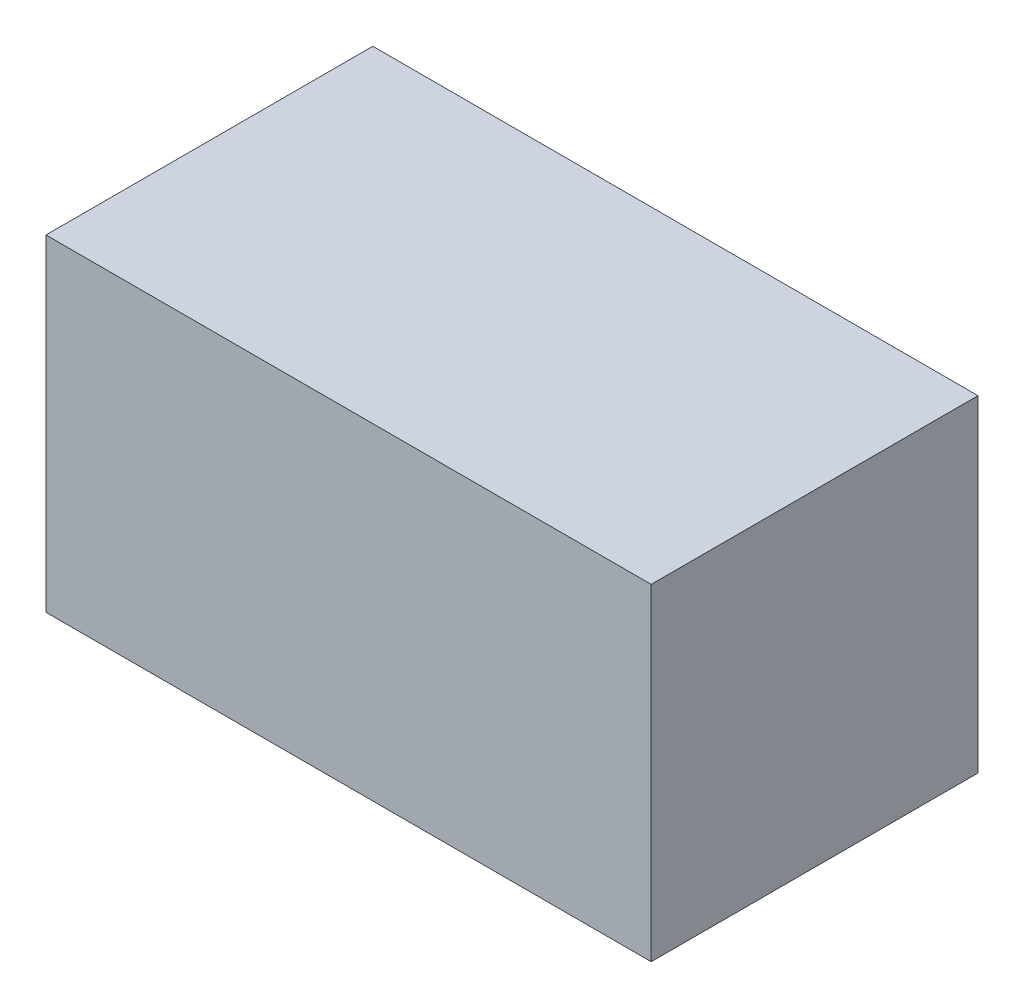
ISO-10303-21;
HEADER;
FILE_DESCRIPTION(('STEP AP214'),'2;1');
FILE_NAME('part.step','',(''),(''),'','','');
FILE_SCHEMA(('AUTOMOTIVE_DESIGN { 1 0 10303 214 1 1 1 1 }'));
ENDSEC;
DATA;
#1=APPLICATION_CONTEXT('core data for automotive mechanical design processes');
#2=APPLICATION_PROTOCOL_DEFINITION('international standard','automotive_design',2000,#1);
#3=PRODUCT_CONTEXT('',#1,'mechanical');
#4=PRODUCT('Part','Part','',(#3));
#5=PRODUCT_RELATED_PRODUCT_CATEGORY('part','',(#4));
#6=PRODUCT_DEFINITION_FORMATION('','',#4);
#7=PRODUCT_DEFINITION_CONTEXT('part definition',#1,'design');
#8=PRODUCT_DEFINITION('design','',#6,#7);
#9=PRODUCT_DEFINITION_SHAPE('','',#8);
#10=(LENGTH_UNIT() NAMED_UNIT(*) SI_UNIT(.MILLI.,.METRE.));
#11=(NAMED_UNIT(*) PLANE_ANGLE_UNIT() SI_UNIT($,.RADIAN.));
#12=(NAMED_UNIT(*) SI_UNIT($,.STERADIAN.) SOLID_ANGLE_UNIT());
#13=UNCERTAINTY_MEASURE_WITH_UNIT(LENGTH_MEASURE(1.E-05),#10,'distance_accuracy_value','');
#14=(GEOMETRIC_REPRESENTATION_CONTEXT(3) GLOBAL_UNCERTAINTY_ASSIGNED_CONTEXT((#13)) GLOBAL_UNIT_ASSIGNED_CONTEXT((#10,
#11,#12)) REPRESENTATION_CONTEXT('',''));
#15=CARTESIAN_POINT('',(0.,0.,0.));
#16=DIRECTION('',(0.,0.,1.));
#17=DIRECTION('',(1.,0.,0.));
#18=AXIS2_PLACEMENT_3D('',#15,#16,#17);
#19=CARTESIAN_POINT('',(1.25,-0.675,1.35));
#20=DIRECTION('',(0.,1.,0.));
#21=DIRECTION('',(0.,0.,1.));
#22=AXIS2_PLACEMENT_3D('',#19,#20,#21);
#23=PLANE('',#22);
#24=DIRECTION('',(1.,0.,0.));
#25=VECTOR('',#24,1.);
#26=CARTESIAN_POINT('',(1.25,-0.675,0.));
#27=LINE('',#26,#25);
#28=CARTESIAN_POINT('',(-1.25,-0.675,0.));
#29=VERTEX_POINT('',#28);
#30=CARTESIAN_POINT('',(1.25,-0.675,0.));
#31=VERTEX_POINT('',#30);
#32=EDGE_CURVE('E97',#29,#31,#27,.T.);
#33=ORIENTED_EDGE('',*,*,#32,.T.);
#34=DIRECTION('',(0.,0.,-1.));
#35=VECTOR('',#34,1.);
#36=CARTESIAN_POINT('',(1.25,-0.675,1.35));
#37=LINE('',#36,#35);
#38=CARTESIAN_POINT('',(1.25,-0.675,1.35));
#39=VERTEX_POINT('',#38);
#40=EDGE_CURVE('E11',#39,#31,#37,.T.);
#41=ORIENTED_EDGE('',*,*,#40,.F.);
#42=DIRECTION('',(1.,0.,0.));
#43=VECTOR('',#42,1.);
#44=CARTESIAN_POINT('',(1.25,-0.675,1.35));
#45=LINE('',#44,#43);
#46=CARTESIAN_POINT('',(-1.25,-0.675,1.35));
#47=VERTEX_POINT('',#46);
#48=EDGE_CURVE('E85',#47,#39,#45,.T.);
#49=ORIENTED_EDGE('',*,*,#48,.F.);
#50=DIRECTION('',(0.,0.,-1.));
#51=VECTOR('',#50,1.);
#52=CARTESIAN_POINT('',(-1.25,-0.675,1.35));
#53=LINE('',#52,#51);
#54=EDGE_CURVE('E93',#47,#29,#53,.T.);
#55=ORIENTED_EDGE('',*,*,#54,.T.);
#56=EDGE_LOOP('',(#33,#41,#49,#55));
#57=FACE_BOUND('',#56,.T.);
#58=ADVANCED_FACE('F34',(#57),#23,.F.);
#59=CARTESIAN_POINT('',(1.25,0.675,1.35));
#60=DIRECTION('',(-1.,0.,0.));
#61=DIRECTION('',(0.,0.,1.));
#62=AXIS2_PLACEMENT_3D('',#59,#60,#61);
#63=PLANE('',#62);
#64=DIRECTION('',(0.,1.,0.));
#65=VECTOR('',#64,1.);
#66=CARTESIAN_POINT('',(1.25,0.675,0.));
#67=LINE('',#66,#65);
#68=CARTESIAN_POINT('',(1.25,0.675,0.));
#69=VERTEX_POINT('',#68);
#70=EDGE_CURVE('E89',#31,#69,#67,.T.);
#71=ORIENTED_EDGE('',*,*,#70,.T.);
#72=DIRECTION('',(0.,0.,-1.));
#73=VECTOR('',#72,1.);
#74=CARTESIAN_POINT('',(1.25,0.675,1.35));
#75=LINE('',#74,#73);
#76=CARTESIAN_POINT('',(1.25,0.675,1.35));
#77=VERTEX_POINT('',#76);
#78=EDGE_CURVE('E42',#77,#69,#75,.T.);
#79=ORIENTED_EDGE('',*,*,#78,.F.);
#80=DIRECTION('',(0.,1.,0.));
#81=VECTOR('',#80,1.);
#82=CARTESIAN_POINT('',(1.25,0.675,1.35));
#83=LINE('',#82,#81);
#84=EDGE_CURVE('E80',#39,#77,#83,.T.);
#85=ORIENTED_EDGE('',*,*,#84,.F.);
#86=ORIENTED_EDGE('',*,*,#40,.T.);
#87=EDGE_LOOP('',(#71,#79,#85,#86));
#88=FACE_BOUND('',#87,.T.);
#89=ADVANCED_FACE('F88',(#88),#63,.F.);
#90=CARTESIAN_POINT('',(-1.25,0.675,1.35));
#91=DIRECTION('',(0.,-1.,0.));
#92=DIRECTION('',(0.,0.,-1.));
#93=AXIS2_PLACEMENT_3D('',#90,#91,#92);
#94=PLANE('',#93);
#95=DIRECTION('',(-1.,0.,0.));
#96=VECTOR('',#95,1.);
#97=CARTESIAN_POINT('',(-1.25,0.675,0.));
#98=LINE('',#97,#96);
#99=CARTESIAN_POINT('',(-1.25,0.675,0.));
#100=VERTEX_POINT('',#99);
#101=EDGE_CURVE('E67',#69,#100,#98,.T.);
#102=ORIENTED_EDGE('',*,*,#101,.T.);
#103=DIRECTION('',(0.,0.,-1.));
#104=VECTOR('',#103,1.);
#105=CARTESIAN_POINT('',(-1.25,0.675,1.35));
#106=LINE('',#105,#104);
#107=CARTESIAN_POINT('',(-1.25,0.675,1.35));
#108=VERTEX_POINT('',#107);
#109=EDGE_CURVE('E90',#108,#100,#106,.T.);
#110=ORIENTED_EDGE('',*,*,#109,.F.);
#111=DIRECTION('',(-1.,0.,0.));
#112=VECTOR('',#111,1.);
#113=CARTESIAN_POINT('',(-1.25,0.675,1.35));
#114=LINE('',#113,#112);
#115=EDGE_CURVE('E83',#77,#108,#114,.T.);
#116=ORIENTED_EDGE('',*,*,#115,.F.);
#117=ORIENTED_EDGE('',*,*,#78,.T.);
#118=EDGE_LOOP('',(#102,#110,#116,#117));
#119=FACE_BOUND('',#118,.T.);
#120=ADVANCED_FACE('F91',(#119),#94,.F.);
#121=CARTESIAN_POINT('',(-1.25,-0.675,1.35));
#122=DIRECTION('',(1.,0.,0.));
#123=DIRECTION('',(0.,0.,-1.));
#124=AXIS2_PLACEMENT_3D('',#121,#122,#123);
#125=PLANE('',#124);
#126=DIRECTION('',(0.,-1.,0.));
#127=VECTOR('',#126,1.);
#128=CARTESIAN_POINT('',(-1.25,-0.675,0.));
#129=LINE('',#128,#127);
#130=EDGE_CURVE('E73',#100,#29,#129,.T.);
#131=ORIENTED_EDGE('',*,*,#130,.T.);
#132=ORIENTED_EDGE('',*,*,#54,.F.);
#133=DIRECTION('',(0.,-1.,0.));
#134=VECTOR('',#133,1.);
#135=CARTESIAN_POINT('',(-1.25,-0.675,1.35));
#136=LINE('',#135,#134);
#137=EDGE_CURVE('E50',#108,#47,#136,.T.);
#138=ORIENTED_EDGE('',*,*,#137,.F.);
#139=ORIENTED_EDGE('',*,*,#109,.T.);
#140=EDGE_LOOP('',(#131,#132,#138,#139));
#141=FACE_BOUND('',#140,.T.);
#142=ADVANCED_FACE('F104',(#141),#125,.F.);
#143=CARTESIAN_POINT('',(0.,0.,1.35));
#144=DIRECTION('',(0.,0.,-1.));
#145=DIRECTION('',(-1.,0.,0.));
#146=AXIS2_PLACEMENT_3D('',#143,#144,#145);
#147=PLANE('',#146);
#148=ORIENTED_EDGE('',*,*,#48,.T.);
#149=ORIENTED_EDGE('',*,*,#84,.T.);
#150=ORIENTED_EDGE('',*,*,#115,.T.);
#151=ORIENTED_EDGE('',*,*,#137,.T.);
#152=EDGE_LOOP('',(#148,#149,#150,#151));
#153=FACE_BOUND('',#152,.T.);
#154=ADVANCED_FACE('F81',(#153),#147,.F.);
#155=CARTESIAN_POINT('',(0.,0.,0.));
#156=DIRECTION('',(0.,0.,-1.));
#157=DIRECTION('',(-1.,0.,0.));
#158=AXIS2_PLACEMENT_3D('',#155,#156,#157);
#159=PLANE('',#158);
#160=ORIENTED_EDGE('',*,*,#32,.F.);
#161=ORIENTED_EDGE('',*,*,#130,.F.);
#162=ORIENTED_EDGE('',*,*,#101,.F.);
#163=ORIENTED_EDGE('',*,*,#70,.F.);
#164=EDGE_LOOP('',(#160,#161,#162,#163));
#165=FACE_BOUND('',#164,.T.);
#166=ADVANCED_FACE('F107',(#165),#159,.T.);
#167=CLOSED_SHELL('',(#58,#89,#120,#142,#154,#166));
#168=MANIFOLD_SOLID_BREP('B2',#167);
#169=ADVANCED_BREP_SHAPE_REPRESENTATION('',(#18,#168),#14);
#170=SHAPE_DEFINITION_REPRESENTATION(#9,#169);
ENDSEC;
END-ISO-10303-21;
